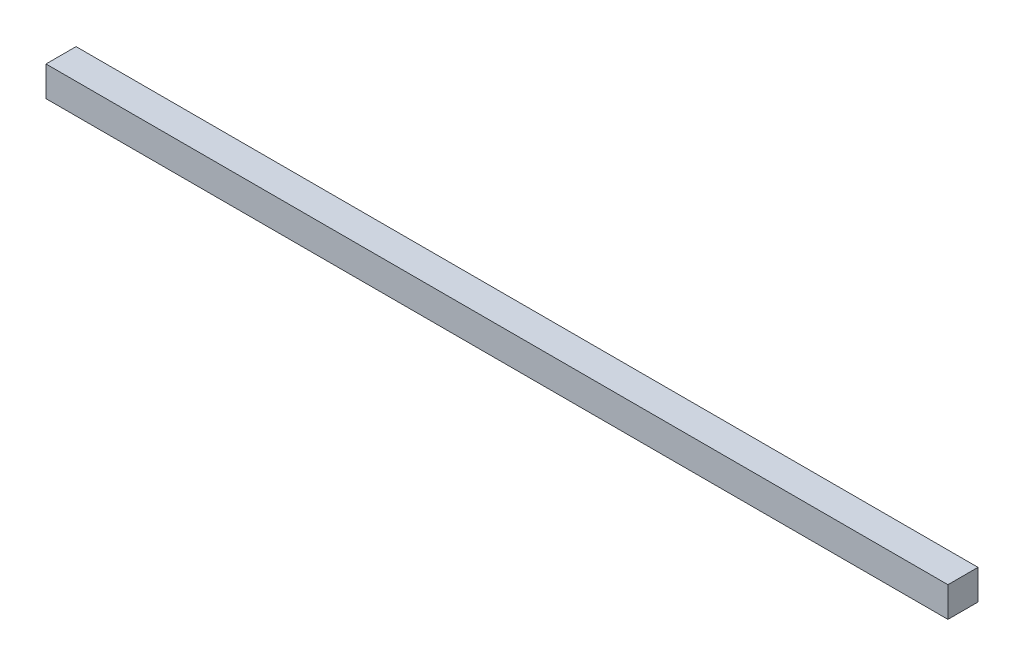
ISO-10303-21;
HEADER;
FILE_DESCRIPTION(('STEP AP214'),'2;1');
FILE_NAME('part.step','',(''),(''),'','','');
FILE_SCHEMA(('AUTOMOTIVE_DESIGN { 1 0 10303 214 1 1 1 1 }'));
ENDSEC;
DATA;
#1=APPLICATION_CONTEXT('core data for automotive mechanical design processes');
#2=APPLICATION_PROTOCOL_DEFINITION('international standard','automotive_design',2000,#1);
#3=PRODUCT_CONTEXT('',#1,'mechanical');
#4=PRODUCT('Part','Part','',(#3));
#5=PRODUCT_RELATED_PRODUCT_CATEGORY('part','',(#4));
#6=PRODUCT_DEFINITION_FORMATION('','',#4);
#7=PRODUCT_DEFINITION_CONTEXT('part definition',#1,'design');
#8=PRODUCT_DEFINITION('design','',#6,#7);
#9=PRODUCT_DEFINITION_SHAPE('','',#8);
#10=(LENGTH_UNIT() NAMED_UNIT(*) SI_UNIT(.MILLI.,.METRE.));
#11=(NAMED_UNIT(*) PLANE_ANGLE_UNIT() SI_UNIT($,.RADIAN.));
#12=(NAMED_UNIT(*) SI_UNIT($,.STERADIAN.) SOLID_ANGLE_UNIT());
#13=UNCERTAINTY_MEASURE_WITH_UNIT(LENGTH_MEASURE(1.E-05),#10,'distance_accuracy_value','');
#14=(GEOMETRIC_REPRESENTATION_CONTEXT(3) GLOBAL_UNCERTAINTY_ASSIGNED_CONTEXT((#13)) GLOBAL_UNIT_ASSIGNED_CONTEXT((#10,
#11,#12)) REPRESENTATION_CONTEXT('',''));
#15=CARTESIAN_POINT('',(0.,0.,0.));
#16=DIRECTION('',(0.,0.,1.));
#17=DIRECTION('',(1.,0.,0.));
#18=AXIS2_PLACEMENT_3D('',#15,#16,#17);
#19=CARTESIAN_POINT('',(-101.785035474979,19.6711798839458,3.));
#20=DIRECTION('',(1.,0.,0.));
#21=DIRECTION('',(0.,0.,-1.));
#22=AXIS2_PLACEMENT_3D('',#19,#20,#21);
#23=PLANE('',#22);
#24=DIRECTION('',(0.,-1.,0.));
#25=VECTOR('',#24,1.);
#26=CARTESIAN_POINT('',(-101.785035474979,19.6711798839458,0.));
#27=LINE('',#26,#25);
#28=CARTESIAN_POINT('',(-101.785035474979,19.6711798839458,0.));
#29=VERTEX_POINT('',#28);
#30=CARTESIAN_POINT('',(-101.785035474979,16.6711798839458,0.));
#31=VERTEX_POINT('',#30);
#32=EDGE_CURVE('E96',#29,#31,#27,.T.);
#33=ORIENTED_EDGE('',*,*,#32,.T.);
#34=DIRECTION('',(0.,0.,-1.));
#35=VECTOR('',#34,1.);
#36=CARTESIAN_POINT('',(-101.785035474979,16.6711798839458,3.));
#37=LINE('',#36,#35);
#38=CARTESIAN_POINT('',(-101.785035474979,16.6711798839458,3.));
#39=VERTEX_POINT('',#38);
#40=EDGE_CURVE('E11',#39,#31,#37,.T.);
#41=ORIENTED_EDGE('',*,*,#40,.F.);
#42=DIRECTION('',(0.,-1.,0.));
#43=VECTOR('',#42,1.);
#44=CARTESIAN_POINT('',(-101.785035474979,19.6711798839458,3.));
#45=LINE('',#44,#43);
#46=CARTESIAN_POINT('',(-101.785035474979,19.6711798839458,3.));
#47=VERTEX_POINT('',#46);
#48=EDGE_CURVE('E84',#47,#39,#45,.T.);
#49=ORIENTED_EDGE('',*,*,#48,.F.);
#50=DIRECTION('',(0.,0.,-1.));
#51=VECTOR('',#50,1.);
#52=CARTESIAN_POINT('',(-101.785035474979,19.6711798839458,3.));
#53=LINE('',#52,#51);
#54=EDGE_CURVE('E92',#47,#29,#53,.T.);
#55=ORIENTED_EDGE('',*,*,#54,.T.);
#56=EDGE_LOOP('',(#33,#41,#49,#55));
#57=FACE_BOUND('',#56,.T.);
#58=ADVANCED_FACE('F33',(#57),#23,.F.);
#59=CARTESIAN_POINT('',(-101.785035474979,16.6711798839458,3.));
#60=DIRECTION('',(0.,1.,0.));
#61=DIRECTION('',(0.,0.,1.));
#62=AXIS2_PLACEMENT_3D('',#59,#60,#61);
#63=PLANE('',#62);
#64=DIRECTION('',(1.,0.,0.));
#65=VECTOR('',#64,1.);
#66=CARTESIAN_POINT('',(-101.785035474979,16.6711798839458,0.));
#67=LINE('',#66,#65);
#68=CARTESIAN_POINT('',(-11.7850354749787,16.6711798839458,0.));
#69=VERTEX_POINT('',#68);
#70=EDGE_CURVE('E88',#31,#69,#67,.T.);
#71=ORIENTED_EDGE('',*,*,#70,.T.);
#72=DIRECTION('',(0.,0.,-1.));
#73=VECTOR('',#72,1.);
#74=CARTESIAN_POINT('',(-11.7850354749787,16.6711798839458,3.));
#75=LINE('',#74,#73);
#76=CARTESIAN_POINT('',(-11.7850354749787,16.6711798839458,3.));
#77=VERTEX_POINT('',#76);
#78=EDGE_CURVE('E41',#77,#69,#75,.T.);
#79=ORIENTED_EDGE('',*,*,#78,.F.);
#80=DIRECTION('',(1.,0.,0.));
#81=VECTOR('',#80,1.);
#82=CARTESIAN_POINT('',(-101.785035474979,16.6711798839458,3.));
#83=LINE('',#82,#81);
#84=EDGE_CURVE('E79',#39,#77,#83,.T.);
#85=ORIENTED_EDGE('',*,*,#84,.F.);
#86=ORIENTED_EDGE('',*,*,#40,.T.);
#87=EDGE_LOOP('',(#71,#79,#85,#86));
#88=FACE_BOUND('',#87,.T.);
#89=ADVANCED_FACE('F87',(#88),#63,.F.);
#90=CARTESIAN_POINT('',(-11.7850354749787,19.6711798839458,3.));
#91=DIRECTION('',(-1.,0.,0.));
#92=DIRECTION('',(0.,-1.,0.));
#93=AXIS2_PLACEMENT_3D('',#90,#91,#92);
#94=PLANE('',#93);
#95=DIRECTION('',(0.,1.,0.));
#96=VECTOR('',#95,1.);
#97=CARTESIAN_POINT('',(-11.7850354749787,19.6711798839458,0.));
#98=LINE('',#97,#96);
#99=CARTESIAN_POINT('',(-11.7850354749787,19.6711798839458,0.));
#100=VERTEX_POINT('',#99);
#101=EDGE_CURVE('E66',#69,#100,#98,.T.);
#102=ORIENTED_EDGE('',*,*,#101,.T.);
#103=DIRECTION('',(0.,0.,-1.));
#104=VECTOR('',#103,1.);
#105=CARTESIAN_POINT('',(-11.7850354749787,19.6711798839458,3.));
#106=LINE('',#105,#104);
#107=CARTESIAN_POINT('',(-11.7850354749787,19.6711798839458,3.));
#108=VERTEX_POINT('',#107);
#109=EDGE_CURVE('E89',#108,#100,#106,.T.);
#110=ORIENTED_EDGE('',*,*,#109,.F.);
#111=DIRECTION('',(0.,1.,0.));
#112=VECTOR('',#111,1.);
#113=CARTESIAN_POINT('',(-11.7850354749787,19.6711798839458,3.));
#114=LINE('',#113,#112);
#115=EDGE_CURVE('E82',#77,#108,#114,.T.);
#116=ORIENTED_EDGE('',*,*,#115,.F.);
#117=ORIENTED_EDGE('',*,*,#78,.T.);
#118=EDGE_LOOP('',(#102,#110,#116,#117));
#119=FACE_BOUND('',#118,.T.);
#120=ADVANCED_FACE('F90',(#119),#94,.F.);
#121=CARTESIAN_POINT('',(-101.785035474979,19.6711798839458,3.));
#122=DIRECTION('',(0.,-1.,0.));
#123=DIRECTION('',(0.,0.,-1.));
#124=AXIS2_PLACEMENT_3D('',#121,#122,#123);
#125=PLANE('',#124);
#126=DIRECTION('',(-1.,0.,0.));
#127=VECTOR('',#126,1.);
#128=CARTESIAN_POINT('',(-101.785035474979,19.6711798839458,0.));
#129=LINE('',#128,#127);
#130=EDGE_CURVE('E72',#100,#29,#129,.T.);
#131=ORIENTED_EDGE('',*,*,#130,.T.);
#132=ORIENTED_EDGE('',*,*,#54,.F.);
#133=DIRECTION('',(-1.,0.,0.));
#134=VECTOR('',#133,1.);
#135=CARTESIAN_POINT('',(-101.785035474979,19.6711798839458,3.));
#136=LINE('',#135,#134);
#137=EDGE_CURVE('E49',#108,#47,#136,.T.);
#138=ORIENTED_EDGE('',*,*,#137,.F.);
#139=ORIENTED_EDGE('',*,*,#109,.T.);
#140=EDGE_LOOP('',(#131,#132,#138,#139));
#141=FACE_BOUND('',#140,.T.);
#142=ADVANCED_FACE('F103',(#141),#125,.F.);
#143=CARTESIAN_POINT('',(0.,0.,3.));
#144=DIRECTION('',(0.,0.,1.));
#145=DIRECTION('',(1.,0.,0.));
#146=AXIS2_PLACEMENT_3D('',#143,#144,#145);
#147=PLANE('',#146);
#148=ORIENTED_EDGE('',*,*,#48,.T.);
#149=ORIENTED_EDGE('',*,*,#84,.T.);
#150=ORIENTED_EDGE('',*,*,#115,.T.);
#151=ORIENTED_EDGE('',*,*,#137,.T.);
#152=EDGE_LOOP('',(#148,#149,#150,#151));
#153=FACE_BOUND('',#152,.T.);
#154=ADVANCED_FACE('F80',(#153),#147,.T.);
#155=CARTESIAN_POINT('',(0.,0.,0.));
#156=DIRECTION('',(0.,0.,1.));
#157=DIRECTION('',(1.,0.,0.));
#158=AXIS2_PLACEMENT_3D('',#155,#156,#157);
#159=PLANE('',#158);
#160=ORIENTED_EDGE('',*,*,#32,.F.);
#161=ORIENTED_EDGE('',*,*,#130,.F.);
#162=ORIENTED_EDGE('',*,*,#101,.F.);
#163=ORIENTED_EDGE('',*,*,#70,.F.);
#164=EDGE_LOOP('',(#160,#161,#162,#163));
#165=FACE_BOUND('',#164,.T.);
#166=ADVANCED_FACE('F106',(#165),#159,.F.);
#167=CLOSED_SHELL('',(#58,#89,#120,#142,#154,#166));
#168=MANIFOLD_SOLID_BREP('B2',#167);
#169=ADVANCED_BREP_SHAPE_REPRESENTATION('',(#18,#168),#14);
#170=SHAPE_DEFINITION_REPRESENTATION(#9,#169);
ENDSEC;
END-ISO-10303-21;
